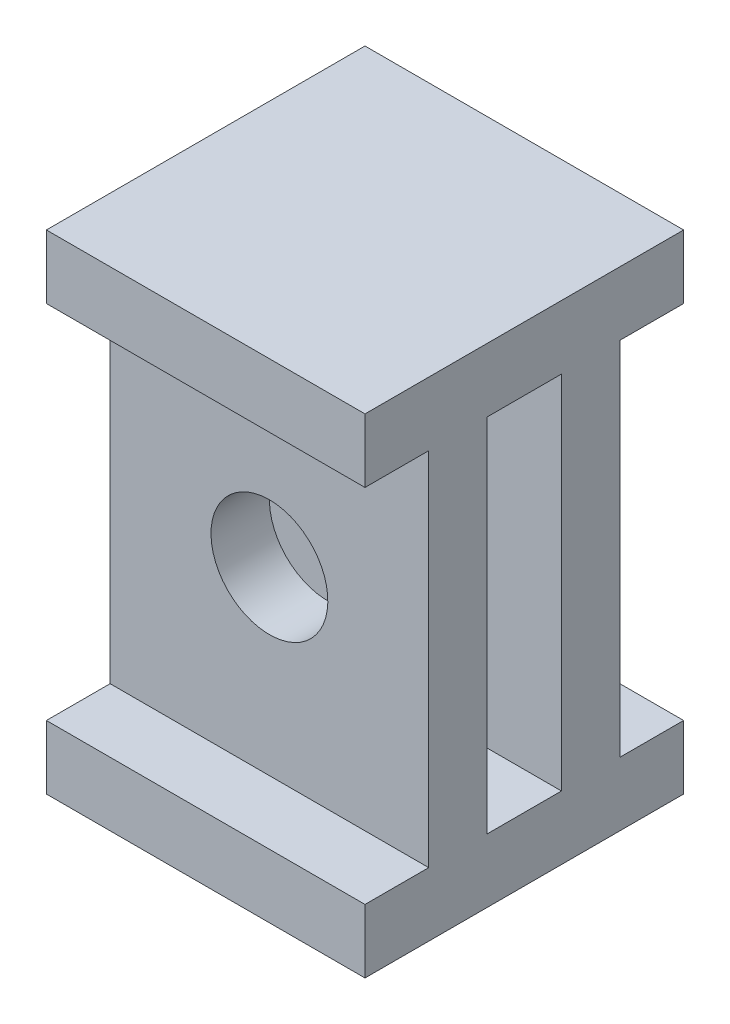
ISO-10303-21;
HEADER;
FILE_DESCRIPTION(('STEP AP214'),'2;1');
FILE_NAME('part.step','',(''),(''),'','','');
FILE_SCHEMA(('AUTOMOTIVE_DESIGN { 1 0 10303 214 1 1 1 1 }'));
ENDSEC;
DATA;
#1=APPLICATION_CONTEXT('core data for automotive mechanical design processes');
#2=APPLICATION_PROTOCOL_DEFINITION('international standard','automotive_design',2000,#1);
#3=PRODUCT_CONTEXT('',#1,'mechanical');
#4=PRODUCT('Part','Part','',(#3));
#5=PRODUCT_RELATED_PRODUCT_CATEGORY('part','',(#4));
#6=PRODUCT_DEFINITION_FORMATION('','',#4);
#7=PRODUCT_DEFINITION_CONTEXT('part definition',#1,'design');
#8=PRODUCT_DEFINITION('design','',#6,#7);
#9=PRODUCT_DEFINITION_SHAPE('','',#8);
#10=(LENGTH_UNIT() NAMED_UNIT(*) SI_UNIT(.MILLI.,.METRE.));
#11=(NAMED_UNIT(*) PLANE_ANGLE_UNIT() SI_UNIT($,.RADIAN.));
#12=(NAMED_UNIT(*) SI_UNIT($,.STERADIAN.) SOLID_ANGLE_UNIT());
#13=UNCERTAINTY_MEASURE_WITH_UNIT(LENGTH_MEASURE(1.E-05),#10,'distance_accuracy_value','');
#14=(GEOMETRIC_REPRESENTATION_CONTEXT(3) GLOBAL_UNCERTAINTY_ASSIGNED_CONTEXT((#13)) GLOBAL_UNIT_ASSIGNED_CONTEXT((#10,
#11,#12)) REPRESENTATION_CONTEXT('',''));
#15=CARTESIAN_POINT('',(0.,0.,0.));
#16=DIRECTION('',(0.,0.,1.));
#17=DIRECTION('',(1.,0.,0.));
#18=AXIS2_PLACEMENT_3D('',#15,#16,#17);
#19=CARTESIAN_POINT('',(0.,23.,-7.5));
#20=DIRECTION('',(0.,0.,1.));
#21=DIRECTION('',(1.,0.,0.));
#22=AXIS2_PLACEMENT_3D('',#19,#20,#21);
#23=PLANE('',#22);
#24=DIRECTION('',(0.,-1.,0.));
#25=VECTOR('',#24,1.);
#26=CARTESIAN_POINT('',(0.,23.,-7.5));
#27=LINE('',#26,#25);
#28=CARTESIAN_POINT('',(0.,3.,-7.5));
#29=VERTEX_POINT('',#28);
#30=CARTESIAN_POINT('',(0.,0.,-7.5));
#31=VERTEX_POINT('',#30);
#32=EDGE_CURVE('E262',#29,#31,#27,.T.);
#33=ORIENTED_EDGE('',*,*,#32,.F.);
#34=DIRECTION('',(1.,0.,0.));
#35=VECTOR('',#34,1.);
#36=CARTESIAN_POINT('',(0.,3.,-7.5));
#37=LINE('',#36,#35);
#38=CARTESIAN_POINT('',(15.,3.,-7.5));
#39=VERTEX_POINT('',#38);
#40=EDGE_CURVE('E181',#29,#39,#37,.T.);
#41=ORIENTED_EDGE('',*,*,#40,.T.);
#42=DIRECTION('',(0.,-1.,0.));
#43=VECTOR('',#42,1.);
#44=CARTESIAN_POINT('',(15.,23.,-7.5));
#45=LINE('',#44,#43);
#46=CARTESIAN_POINT('',(15.,0.,-7.5));
#47=VERTEX_POINT('',#46);
#48=EDGE_CURVE('E42',#39,#47,#45,.T.);
#49=ORIENTED_EDGE('',*,*,#48,.T.);
#50=DIRECTION('',(-1.,0.,0.));
#51=VECTOR('',#50,1.);
#52=CARTESIAN_POINT('',(0.,0.,-7.5));
#53=LINE('',#52,#51);
#54=EDGE_CURVE('E258',#47,#31,#53,.T.);
#55=ORIENTED_EDGE('',*,*,#54,.T.);
#56=EDGE_LOOP('',(#33,#41,#49,#55));
#57=FACE_BOUND('',#56,.T.);
#58=ADVANCED_FACE('F33',(#57),#23,.F.);
#59=CARTESIAN_POINT('',(0.,23.,7.5));
#60=DIRECTION('',(0.,0.,-1.));
#61=DIRECTION('',(1.,0.,0.));
#62=AXIS2_PLACEMENT_3D('',#59,#60,#61);
#63=PLANE('',#62);
#64=DIRECTION('',(0.,-1.,0.));
#65=VECTOR('',#64,1.);
#66=CARTESIAN_POINT('',(0.,23.,7.5));
#67=LINE('',#66,#65);
#68=CARTESIAN_POINT('',(0.,23.,7.5));
#69=VERTEX_POINT('',#68);
#70=CARTESIAN_POINT('',(0.,20.,7.5));
#71=VERTEX_POINT('',#70);
#72=EDGE_CURVE('E247',#69,#71,#67,.T.);
#73=ORIENTED_EDGE('',*,*,#72,.T.);
#74=DIRECTION('',(1.,0.,0.));
#75=VECTOR('',#74,1.);
#76=CARTESIAN_POINT('',(0.,20.,7.5));
#77=LINE('',#76,#75);
#78=CARTESIAN_POINT('',(15.,20.,7.5));
#79=VERTEX_POINT('',#78);
#80=EDGE_CURVE('E183',#71,#79,#77,.T.);
#81=ORIENTED_EDGE('',*,*,#80,.T.);
#82=DIRECTION('',(0.,-1.,0.));
#83=VECTOR('',#82,1.);
#84=CARTESIAN_POINT('',(15.,23.,7.5));
#85=LINE('',#84,#83);
#86=CARTESIAN_POINT('',(15.,23.,7.5));
#87=VERTEX_POINT('',#86);
#88=EDGE_CURVE('E251',#87,#79,#85,.T.);
#89=ORIENTED_EDGE('',*,*,#88,.F.);
#90=DIRECTION('',(-1.,0.,0.));
#91=VECTOR('',#90,1.);
#92=CARTESIAN_POINT('',(0.,23.,7.5));
#93=LINE('',#92,#91);
#94=EDGE_CURVE('E242',#87,#69,#93,.T.);
#95=ORIENTED_EDGE('',*,*,#94,.T.);
#96=EDGE_LOOP('',(#73,#81,#89,#95));
#97=FACE_BOUND('',#96,.T.);
#98=ADVANCED_FACE('F293',(#97),#63,.F.);
#99=CARTESIAN_POINT('',(0.,23.,0.));
#100=DIRECTION('',(1.,0.,0.));
#101=DIRECTION('',(0.,0.,-1.));
#102=AXIS2_PLACEMENT_3D('',#99,#100,#101);
#103=PLANE('',#102);
#104=DIRECTION('',(0.,0.,1.));
#105=VECTOR('',#104,1.);
#106=CARTESIAN_POINT('',(0.,20.,1.75));
#107=LINE('',#106,#105);
#108=CARTESIAN_POINT('',(0.,20.,-1.75));
#109=VERTEX_POINT('',#108);
#110=CARTESIAN_POINT('',(0.,20.,1.75));
#111=VERTEX_POINT('',#110);
#112=EDGE_CURVE('E223',#109,#111,#107,.T.);
#113=ORIENTED_EDGE('',*,*,#112,.T.);
#114=DIRECTION('',(0.,-1.,0.));
#115=VECTOR('',#114,1.);
#116=CARTESIAN_POINT('',(0.,20.,1.75));
#117=LINE('',#116,#115);
#118=CARTESIAN_POINT('',(0.,3.,1.75));
#119=VERTEX_POINT('',#118);
#120=EDGE_CURVE('E215',#111,#119,#117,.T.);
#121=ORIENTED_EDGE('',*,*,#120,.T.);
#122=DIRECTION('',(0.,0.,-1.));
#123=VECTOR('',#122,1.);
#124=CARTESIAN_POINT('',(0.,3.,1.75));
#125=LINE('',#124,#123);
#126=CARTESIAN_POINT('',(0.,3.,-1.75));
#127=VERTEX_POINT('',#126);
#128=EDGE_CURVE('E218',#119,#127,#125,.T.);
#129=ORIENTED_EDGE('',*,*,#128,.T.);
#130=DIRECTION('',(0.,1.,0.));
#131=VECTOR('',#130,1.);
#132=CARTESIAN_POINT('',(0.,20.,-1.75));
#133=LINE('',#132,#131);
#134=EDGE_CURVE('E49',#127,#109,#133,.T.);
#135=ORIENTED_EDGE('',*,*,#134,.T.);
#136=EDGE_LOOP('',(#113,#121,#129,#135));
#137=FACE_BOUND('',#136,.T.);
#138=DIRECTION('',(0.,1.,0.));
#139=VECTOR('',#138,1.);
#140=CARTESIAN_POINT('',(0.,20.,4.5));
#141=LINE('',#140,#139);
#142=CARTESIAN_POINT('',(0.,3.,4.5));
#143=VERTEX_POINT('',#142);
#144=CARTESIAN_POINT('',(0.,20.,4.5));
#145=VERTEX_POINT('',#144);
#146=EDGE_CURVE('E161',#143,#145,#141,.T.);
#147=ORIENTED_EDGE('',*,*,#146,.T.);
#148=DIRECTION('',(0.,0.,1.));
#149=VECTOR('',#148,1.);
#150=CARTESIAN_POINT('',(0.,20.,7.5));
#151=LINE('',#150,#149);
#152=EDGE_CURVE('E166',#145,#71,#151,.T.);
#153=ORIENTED_EDGE('',*,*,#152,.T.);
#154=ORIENTED_EDGE('',*,*,#72,.F.);
#155=DIRECTION('',(0.,0.,1.));
#156=VECTOR('',#155,1.);
#157=CARTESIAN_POINT('',(0.,23.,0.));
#158=LINE('',#157,#156);
#159=CARTESIAN_POINT('',(0.,23.,-7.5));
#160=VERTEX_POINT('',#159);
#161=EDGE_CURVE('E255',#160,#69,#158,.T.);
#162=ORIENTED_EDGE('',*,*,#161,.F.);
#163=CARTESIAN_POINT('',(0.,20.,-7.5));
#164=VERTEX_POINT('',#163);
#165=EDGE_CURVE('E269',#160,#164,#27,.T.);
#166=ORIENTED_EDGE('',*,*,#165,.T.);
#167=DIRECTION('',(0.,0.,1.));
#168=VECTOR('',#167,1.);
#169=CARTESIAN_POINT('',(0.,20.,-7.5));
#170=LINE('',#169,#168);
#171=CARTESIAN_POINT('',(0.,20.,-4.5));
#172=VERTEX_POINT('',#171);
#173=EDGE_CURVE('E189',#164,#172,#170,.T.);
#174=ORIENTED_EDGE('',*,*,#173,.T.);
#175=DIRECTION('',(0.,-1.,0.));
#176=VECTOR('',#175,1.);
#177=CARTESIAN_POINT('',(0.,20.,-4.5));
#178=LINE('',#177,#176);
#179=CARTESIAN_POINT('',(0.,3.,-4.5));
#180=VERTEX_POINT('',#179);
#181=EDGE_CURVE('E192',#172,#180,#178,.T.);
#182=ORIENTED_EDGE('',*,*,#181,.T.);
#183=DIRECTION('',(0.,0.,-1.));
#184=VECTOR('',#183,1.);
#185=CARTESIAN_POINT('',(0.,3.,-7.5));
#186=LINE('',#185,#184);
#187=EDGE_CURVE('E196',#180,#29,#186,.T.);
#188=ORIENTED_EDGE('',*,*,#187,.T.);
#189=ORIENTED_EDGE('',*,*,#32,.T.);
#190=DIRECTION('',(0.,0.,1.));
#191=VECTOR('',#190,1.);
#192=CARTESIAN_POINT('',(0.,0.,0.));
#193=LINE('',#192,#191);
#194=CARTESIAN_POINT('',(0.,0.,7.5));
#195=VERTEX_POINT('',#194);
#196=EDGE_CURVE('E254',#31,#195,#193,.T.);
#197=ORIENTED_EDGE('',*,*,#196,.T.);
#198=CARTESIAN_POINT('',(0.,3.,7.5));
#199=VERTEX_POINT('',#198);
#200=EDGE_CURVE('E170',#199,#195,#67,.T.);
#201=ORIENTED_EDGE('',*,*,#200,.F.);
#202=DIRECTION('',(0.,0.,-1.));
#203=VECTOR('',#202,1.);
#204=CARTESIAN_POINT('',(0.,3.,7.5));
#205=LINE('',#204,#203);
#206=EDGE_CURVE('E150',#199,#143,#205,.T.);
#207=ORIENTED_EDGE('',*,*,#206,.T.);
#208=EDGE_LOOP('',(#147,#153,#154,#162,#166,#174,#182,#188,#189,#197,#201,#207));
#209=FACE_BOUND('',#208,.T.);
#210=ADVANCED_FACE('F35',(#137,#209),#103,.F.);
#211=CARTESIAN_POINT('',(15.,23.,0.));
#212=DIRECTION('',(-1.,0.,0.));
#213=DIRECTION('',(0.,0.,1.));
#214=AXIS2_PLACEMENT_3D('',#211,#212,#213);
#215=PLANE('',#214);
#216=DIRECTION('',(0.,0.,-1.));
#217=VECTOR('',#216,1.);
#218=CARTESIAN_POINT('',(15.,3.,1.75));
#219=LINE('',#218,#217);
#220=CARTESIAN_POINT('',(15.,3.,1.75));
#221=VERTEX_POINT('',#220);
#222=CARTESIAN_POINT('',(15.,3.,-1.75));
#223=VERTEX_POINT('',#222);
#224=EDGE_CURVE('E228',#221,#223,#219,.T.);
#225=ORIENTED_EDGE('',*,*,#224,.F.);
#226=DIRECTION('',(0.,-1.,0.));
#227=VECTOR('',#226,1.);
#228=CARTESIAN_POINT('',(15.,20.,1.75));
#229=LINE('',#228,#227);
#230=CARTESIAN_POINT('',(15.,20.,1.75));
#231=VERTEX_POINT('',#230);
#232=EDGE_CURVE('E57',#231,#221,#229,.T.);
#233=ORIENTED_EDGE('',*,*,#232,.F.);
#234=DIRECTION('',(0.,0.,1.));
#235=VECTOR('',#234,1.);
#236=CARTESIAN_POINT('',(15.,20.,1.75));
#237=LINE('',#236,#235);
#238=CARTESIAN_POINT('',(15.,20.,-1.75));
#239=VERTEX_POINT('',#238);
#240=EDGE_CURVE('E219',#239,#231,#237,.T.);
#241=ORIENTED_EDGE('',*,*,#240,.F.);
#242=DIRECTION('',(0.,1.,0.));
#243=VECTOR('',#242,1.);
#244=CARTESIAN_POINT('',(15.,20.,-1.75));
#245=LINE('',#244,#243);
#246=EDGE_CURVE('E231',#223,#239,#245,.T.);
#247=ORIENTED_EDGE('',*,*,#246,.F.);
#248=EDGE_LOOP('',(#225,#233,#241,#247));
#249=FACE_BOUND('',#248,.T.);
#250=ORIENTED_EDGE('',*,*,#88,.T.);
#251=DIRECTION('',(0.,0.,1.));
#252=VECTOR('',#251,1.);
#253=CARTESIAN_POINT('',(15.,20.,7.5));
#254=LINE('',#253,#252);
#255=CARTESIAN_POINT('',(15.,20.,4.5));
#256=VERTEX_POINT('',#255);
#257=EDGE_CURVE('E171',#256,#79,#254,.T.);
#258=ORIENTED_EDGE('',*,*,#257,.F.);
#259=DIRECTION('',(0.,1.,0.));
#260=VECTOR('',#259,1.);
#261=CARTESIAN_POINT('',(15.,20.,4.5));
#262=LINE('',#261,#260);
#263=CARTESIAN_POINT('',(15.,3.,4.5));
#264=VERTEX_POINT('',#263);
#265=EDGE_CURVE('E173',#264,#256,#262,.T.);
#266=ORIENTED_EDGE('',*,*,#265,.F.);
#267=DIRECTION('',(0.,0.,-1.));
#268=VECTOR('',#267,1.);
#269=CARTESIAN_POINT('',(15.,3.,7.5));
#270=LINE('',#269,#268);
#271=CARTESIAN_POINT('',(15.,3.,7.5));
#272=VERTEX_POINT('',#271);
#273=EDGE_CURVE('E153',#272,#264,#270,.T.);
#274=ORIENTED_EDGE('',*,*,#273,.F.);
#275=CARTESIAN_POINT('',(15.,0.,7.5));
#276=VERTEX_POINT('',#275);
#277=EDGE_CURVE('E250',#272,#276,#85,.T.);
#278=ORIENTED_EDGE('',*,*,#277,.T.);
#279=DIRECTION('',(0.,0.,-1.));
#280=VECTOR('',#279,1.);
#281=CARTESIAN_POINT('',(15.,0.,0.));
#282=LINE('',#281,#280);
#283=EDGE_CURVE('E264',#276,#47,#282,.T.);
#284=ORIENTED_EDGE('',*,*,#283,.T.);
#285=ORIENTED_EDGE('',*,*,#48,.F.);
#286=DIRECTION('',(0.,0.,-1.));
#287=VECTOR('',#286,1.);
#288=CARTESIAN_POINT('',(15.,3.,-7.5));
#289=LINE('',#288,#287);
#290=CARTESIAN_POINT('',(15.,3.,-4.5));
#291=VERTEX_POINT('',#290);
#292=EDGE_CURVE('E193',#291,#39,#289,.T.);
#293=ORIENTED_EDGE('',*,*,#292,.F.);
#294=DIRECTION('',(0.,-1.,0.));
#295=VECTOR('',#294,1.);
#296=CARTESIAN_POINT('',(15.,20.,-4.5));
#297=LINE('',#296,#295);
#298=CARTESIAN_POINT('',(15.,20.,-4.5));
#299=VERTEX_POINT('',#298);
#300=EDGE_CURVE('E203',#299,#291,#297,.T.);
#301=ORIENTED_EDGE('',*,*,#300,.F.);
#302=DIRECTION('',(0.,0.,1.));
#303=VECTOR('',#302,1.);
#304=CARTESIAN_POINT('',(15.,20.,-7.5));
#305=LINE('',#304,#303);
#306=CARTESIAN_POINT('',(15.,20.,-7.5));
#307=VERTEX_POINT('',#306);
#308=EDGE_CURVE('E200',#307,#299,#305,.T.);
#309=ORIENTED_EDGE('',*,*,#308,.F.);
#310=CARTESIAN_POINT('',(15.,23.,-7.5));
#311=VERTEX_POINT('',#310);
#312=EDGE_CURVE('E11',#311,#307,#45,.T.);
#313=ORIENTED_EDGE('',*,*,#312,.F.);
#314=DIRECTION('',(0.,0.,-1.));
#315=VECTOR('',#314,1.);
#316=CARTESIAN_POINT('',(15.,23.,0.));
#317=LINE('',#316,#315);
#318=EDGE_CURVE('E257',#87,#311,#317,.T.);
#319=ORIENTED_EDGE('',*,*,#318,.F.);
#320=EDGE_LOOP('',(#250,#258,#266,#274,#278,#284,#285,#293,#301,#309,#313,#319));
#321=FACE_BOUND('',#320,.T.);
#322=ADVANCED_FACE('F287',(#249,#321),#215,.F.);
#323=ORIENTED_EDGE('',*,*,#312,.T.);
#324=DIRECTION('',(1.,0.,0.));
#325=VECTOR('',#324,1.);
#326=CARTESIAN_POINT('',(0.,20.,-7.5));
#327=LINE('',#326,#325);
#328=EDGE_CURVE('E199',#164,#307,#327,.T.);
#329=ORIENTED_EDGE('',*,*,#328,.F.);
#330=ORIENTED_EDGE('',*,*,#165,.F.);
#331=DIRECTION('',(-1.,0.,0.));
#332=VECTOR('',#331,1.);
#333=CARTESIAN_POINT('',(0.,23.,-7.5));
#334=LINE('',#333,#332);
#335=EDGE_CURVE('E260',#311,#160,#334,.T.);
#336=ORIENTED_EDGE('',*,*,#335,.F.);
#337=EDGE_LOOP('',(#323,#329,#330,#336));
#338=FACE_BOUND('',#337,.T.);
#339=ADVANCED_FACE('F302',(#338),#23,.F.);
#340=CARTESIAN_POINT('',(0.,23.,0.));
#341=DIRECTION('',(0.,-1.,0.));
#342=DIRECTION('',(0.,0.,-1.));
#343=AXIS2_PLACEMENT_3D('',#340,#341,#342);
#344=PLANE('',#343);
#345=ORIENTED_EDGE('',*,*,#161,.T.);
#346=ORIENTED_EDGE('',*,*,#94,.F.);
#347=ORIENTED_EDGE('',*,*,#318,.T.);
#348=ORIENTED_EDGE('',*,*,#335,.T.);
#349=EDGE_LOOP('',(#345,#346,#347,#348));
#350=FACE_BOUND('',#349,.T.);
#351=ADVANCED_FACE('F297',(#350),#344,.F.);
#352=CARTESIAN_POINT('',(0.,0.,0.));
#353=DIRECTION('',(0.,-1.,0.));
#354=DIRECTION('',(0.,0.,-1.));
#355=AXIS2_PLACEMENT_3D('',#352,#353,#354);
#356=PLANE('',#355);
#357=ORIENTED_EDGE('',*,*,#196,.F.);
#358=ORIENTED_EDGE('',*,*,#54,.F.);
#359=ORIENTED_EDGE('',*,*,#283,.F.);
#360=DIRECTION('',(-1.,0.,0.));
#361=VECTOR('',#360,1.);
#362=CARTESIAN_POINT('',(0.,0.,7.5));
#363=LINE('',#362,#361);
#364=EDGE_CURVE('E186',#276,#195,#363,.T.);
#365=ORIENTED_EDGE('',*,*,#364,.T.);
#366=EDGE_LOOP('',(#357,#358,#359,#365));
#367=FACE_BOUND('',#366,.T.);
#368=ADVANCED_FACE('F281',(#367),#356,.T.);
#369=ORIENTED_EDGE('',*,*,#277,.F.);
#370=DIRECTION('',(1.,0.,0.));
#371=VECTOR('',#370,1.);
#372=CARTESIAN_POINT('',(0.,3.,7.5));
#373=LINE('',#372,#371);
#374=EDGE_CURVE('E158',#199,#272,#373,.T.);
#375=ORIENTED_EDGE('',*,*,#374,.F.);
#376=ORIENTED_EDGE('',*,*,#200,.T.);
#377=ORIENTED_EDGE('',*,*,#364,.F.);
#378=EDGE_LOOP('',(#369,#375,#376,#377));
#379=FACE_BOUND('',#378,.T.);
#380=ADVANCED_FACE('F285',(#379),#63,.F.);
#381=CARTESIAN_POINT('',(0.,20.,7.5));
#382=DIRECTION('',(0.,1.,0.));
#383=DIRECTION('',(0.,0.,1.));
#384=AXIS2_PLACEMENT_3D('',#381,#382,#383);
#385=PLANE('',#384);
#386=ORIENTED_EDGE('',*,*,#257,.T.);
#387=ORIENTED_EDGE('',*,*,#80,.F.);
#388=ORIENTED_EDGE('',*,*,#152,.F.);
#389=DIRECTION('',(1.,0.,0.));
#390=VECTOR('',#389,1.);
#391=CARTESIAN_POINT('',(0.,20.,4.5));
#392=LINE('',#391,#390);
#393=EDGE_CURVE('E157',#145,#256,#392,.T.);
#394=ORIENTED_EDGE('',*,*,#393,.T.);
#395=EDGE_LOOP('',(#386,#387,#388,#394));
#396=FACE_BOUND('',#395,.T.);
#397=ADVANCED_FACE('F291',(#396),#385,.F.);
#398=CARTESIAN_POINT('',(0.,20.,4.5));
#399=DIRECTION('',(0.,0.,-1.));
#400=DIRECTION('',(0.,1.,0.));
#401=AXIS2_PLACEMENT_3D('',#398,#399,#400);
#402=PLANE('',#401);
#403=CARTESIAN_POINT('',(7.5,11.5,4.5));
#404=DIRECTION('',(0.,0.,-1.));
#405=DIRECTION('',(0.,1.,0.));
#406=AXIS2_PLACEMENT_3D('',#403,#404,#405);
#407=CIRCLE('',#406,2.75);
#408=CARTESIAN_POINT('',(7.5,14.25,4.5));
#409=VERTEX_POINT('',#408);
#410=EDGE_CURVE('E176',#409,#409,#407,.T.);
#411=ORIENTED_EDGE('',*,*,#410,.T.);
#412=EDGE_LOOP('',(#411));
#413=FACE_BOUND('',#412,.T.);
#414=ORIENTED_EDGE('',*,*,#265,.T.);
#415=ORIENTED_EDGE('',*,*,#393,.F.);
#416=ORIENTED_EDGE('',*,*,#146,.F.);
#417=DIRECTION('',(1.,0.,0.));
#418=VECTOR('',#417,1.);
#419=CARTESIAN_POINT('',(0.,3.,4.5));
#420=LINE('',#419,#418);
#421=EDGE_CURVE('E146',#143,#264,#420,.T.);
#422=ORIENTED_EDGE('',*,*,#421,.T.);
#423=EDGE_LOOP('',(#414,#415,#416,#422));
#424=FACE_BOUND('',#423,.T.);
#425=ADVANCED_FACE('F162',(#413,#424),#402,.F.);
#426=CARTESIAN_POINT('',(0.,3.,7.5));
#427=DIRECTION('',(0.,-1.,0.));
#428=DIRECTION('',(0.,0.,-1.));
#429=AXIS2_PLACEMENT_3D('',#426,#427,#428);
#430=PLANE('',#429);
#431=ORIENTED_EDGE('',*,*,#273,.T.);
#432=ORIENTED_EDGE('',*,*,#421,.F.);
#433=ORIENTED_EDGE('',*,*,#206,.F.);
#434=ORIENTED_EDGE('',*,*,#374,.T.);
#435=EDGE_LOOP('',(#431,#432,#433,#434));
#436=FACE_BOUND('',#435,.T.);
#437=ADVANCED_FACE('F148',(#436),#430,.F.);
#438=CARTESIAN_POINT('',(0.,3.,-7.5));
#439=DIRECTION('',(0.,-1.,0.));
#440=DIRECTION('',(0.,0.,-1.));
#441=AXIS2_PLACEMENT_3D('',#438,#439,#440);
#442=PLANE('',#441);
#443=ORIENTED_EDGE('',*,*,#292,.T.);
#444=ORIENTED_EDGE('',*,*,#40,.F.);
#445=ORIENTED_EDGE('',*,*,#187,.F.);
#446=DIRECTION('',(1.,0.,0.));
#447=VECTOR('',#446,1.);
#448=CARTESIAN_POINT('',(0.,3.,-4.5));
#449=LINE('',#448,#447);
#450=EDGE_CURVE('E210',#180,#291,#449,.T.);
#451=ORIENTED_EDGE('',*,*,#450,.T.);
#452=EDGE_LOOP('',(#443,#444,#445,#451));
#453=FACE_BOUND('',#452,.T.);
#454=ADVANCED_FACE('F312',(#453),#442,.F.);
#455=CARTESIAN_POINT('',(0.,20.,-4.5));
#456=DIRECTION('',(0.,0.,1.));
#457=DIRECTION('',(0.,-1.,0.));
#458=AXIS2_PLACEMENT_3D('',#455,#456,#457);
#459=PLANE('',#458);
#460=CARTESIAN_POINT('',(7.5,11.5,-4.5));
#461=DIRECTION('',(0.,0.,-1.));
#462=DIRECTION('',(0.,1.,0.));
#463=AXIS2_PLACEMENT_3D('',#460,#461,#462);
#464=CIRCLE('',#463,2.75);
#465=CARTESIAN_POINT('',(7.5,14.25,-4.5));
#466=VERTEX_POINT('',#465);
#467=EDGE_CURVE('E449',#466,#466,#464,.T.);
#468=ORIENTED_EDGE('',*,*,#467,.F.);
#469=EDGE_LOOP('',(#468));
#470=FACE_BOUND('',#469,.T.);
#471=ORIENTED_EDGE('',*,*,#300,.T.);
#472=ORIENTED_EDGE('',*,*,#450,.F.);
#473=ORIENTED_EDGE('',*,*,#181,.F.);
#474=DIRECTION('',(1.,0.,0.));
#475=VECTOR('',#474,1.);
#476=CARTESIAN_POINT('',(0.,20.,-4.5));
#477=LINE('',#476,#475);
#478=EDGE_CURVE('E212',#172,#299,#477,.T.);
#479=ORIENTED_EDGE('',*,*,#478,.T.);
#480=EDGE_LOOP('',(#471,#472,#473,#479));
#481=FACE_BOUND('',#480,.T.);
#482=ADVANCED_FACE('F309',(#470,#481),#459,.F.);
#483=CARTESIAN_POINT('',(0.,20.,-7.5));
#484=DIRECTION('',(0.,1.,0.));
#485=DIRECTION('',(0.,0.,1.));
#486=AXIS2_PLACEMENT_3D('',#483,#484,#485);
#487=PLANE('',#486);
#488=ORIENTED_EDGE('',*,*,#308,.T.);
#489=ORIENTED_EDGE('',*,*,#478,.F.);
#490=ORIENTED_EDGE('',*,*,#173,.F.);
#491=ORIENTED_EDGE('',*,*,#328,.T.);
#492=EDGE_LOOP('',(#488,#489,#490,#491));
#493=FACE_BOUND('',#492,.T.);
#494=ADVANCED_FACE('F305',(#493),#487,.F.);
#495=CARTESIAN_POINT('',(0.,20.,1.75));
#496=DIRECTION('',(0.,0.,1.));
#497=DIRECTION('',(0.,-1.,0.));
#498=AXIS2_PLACEMENT_3D('',#495,#496,#497);
#499=PLANE('',#498);
#500=CARTESIAN_POINT('',(7.5,11.5,1.75));
#501=DIRECTION('',(0.,0.,1.));
#502=DIRECTION('',(0.,-1.,0.));
#503=AXIS2_PLACEMENT_3D('',#500,#501,#502);
#504=CIRCLE('',#503,2.75);
#505=CARTESIAN_POINT('',(7.5,14.25,1.75));
#506=VERTEX_POINT('',#505);
#507=EDGE_CURVE('E446',#506,#506,#504,.T.);
#508=ORIENTED_EDGE('',*,*,#507,.T.);
#509=EDGE_LOOP('',(#508));
#510=FACE_BOUND('',#509,.T.);
#511=ORIENTED_EDGE('',*,*,#232,.T.);
#512=DIRECTION('',(1.,0.,0.));
#513=VECTOR('',#512,1.);
#514=CARTESIAN_POINT('',(0.,3.,1.75));
#515=LINE('',#514,#513);
#516=EDGE_CURVE('E226',#119,#221,#515,.T.);
#517=ORIENTED_EDGE('',*,*,#516,.F.);
#518=ORIENTED_EDGE('',*,*,#120,.F.);
#519=DIRECTION('',(1.,0.,0.));
#520=VECTOR('',#519,1.);
#521=CARTESIAN_POINT('',(0.,20.,1.75));
#522=LINE('',#521,#520);
#523=EDGE_CURVE('E204',#111,#231,#522,.T.);
#524=ORIENTED_EDGE('',*,*,#523,.T.);
#525=EDGE_LOOP('',(#511,#517,#518,#524));
#526=FACE_BOUND('',#525,.T.);
#527=ADVANCED_FACE('F347',(#510,#526),#499,.F.);
#528=CARTESIAN_POINT('',(0.,20.,1.75));
#529=DIRECTION('',(0.,1.,0.));
#530=DIRECTION('',(0.,0.,1.));
#531=AXIS2_PLACEMENT_3D('',#528,#529,#530);
#532=PLANE('',#531);
#533=ORIENTED_EDGE('',*,*,#240,.T.);
#534=ORIENTED_EDGE('',*,*,#523,.F.);
#535=ORIENTED_EDGE('',*,*,#112,.F.);
#536=DIRECTION('',(1.,0.,0.));
#537=VECTOR('',#536,1.);
#538=CARTESIAN_POINT('',(0.,20.,-1.75));
#539=LINE('',#538,#537);
#540=EDGE_CURVE('E237',#109,#239,#539,.T.);
#541=ORIENTED_EDGE('',*,*,#540,.T.);
#542=EDGE_LOOP('',(#533,#534,#535,#541));
#543=FACE_BOUND('',#542,.T.);
#544=ADVANCED_FACE('F350',(#543),#532,.F.);
#545=CARTESIAN_POINT('',(0.,20.,-1.75));
#546=DIRECTION('',(0.,0.,-1.));
#547=DIRECTION('',(0.,1.,0.));
#548=AXIS2_PLACEMENT_3D('',#545,#546,#547);
#549=PLANE('',#548);
#550=CARTESIAN_POINT('',(7.5,11.5,-1.75));
#551=DIRECTION('',(0.,0.,-1.));
#552=DIRECTION('',(0.,1.,0.));
#553=AXIS2_PLACEMENT_3D('',#550,#551,#552);
#554=CIRCLE('',#553,2.75);
#555=CARTESIAN_POINT('',(7.5,14.25,-1.75));
#556=VERTEX_POINT('',#555);
#557=EDGE_CURVE('E37',#556,#556,#554,.T.);
#558=ORIENTED_EDGE('',*,*,#557,.T.);
#559=EDGE_LOOP('',(#558));
#560=FACE_BOUND('',#559,.T.);
#561=ORIENTED_EDGE('',*,*,#246,.T.);
#562=ORIENTED_EDGE('',*,*,#540,.F.);
#563=ORIENTED_EDGE('',*,*,#134,.F.);
#564=DIRECTION('',(1.,0.,0.));
#565=VECTOR('',#564,1.);
#566=CARTESIAN_POINT('',(0.,3.,-1.75));
#567=LINE('',#566,#565);
#568=EDGE_CURVE('E239',#127,#223,#567,.T.);
#569=ORIENTED_EDGE('',*,*,#568,.T.);
#570=EDGE_LOOP('',(#561,#562,#563,#569));
#571=FACE_BOUND('',#570,.T.);
#572=ADVANCED_FACE('F351',(#560,#571),#549,.F.);
#573=CARTESIAN_POINT('',(0.,3.,1.75));
#574=DIRECTION('',(0.,-1.,0.));
#575=DIRECTION('',(0.,0.,-1.));
#576=AXIS2_PLACEMENT_3D('',#573,#574,#575);
#577=PLANE('',#576);
#578=ORIENTED_EDGE('',*,*,#224,.T.);
#579=ORIENTED_EDGE('',*,*,#568,.F.);
#580=ORIENTED_EDGE('',*,*,#128,.F.);
#581=ORIENTED_EDGE('',*,*,#516,.T.);
#582=EDGE_LOOP('',(#578,#579,#580,#581));
#583=FACE_BOUND('',#582,.T.);
#584=ADVANCED_FACE('F344',(#583),#577,.F.);
#585=CARTESIAN_POINT('',(7.5,11.5,7.5));
#586=DIRECTION('',(0.,0.,-1.));
#587=DIRECTION('',(0.,1.,0.));
#588=AXIS2_PLACEMENT_3D('',#585,#586,#587);
#589=CYLINDRICAL_SURFACE('',#588,2.75);
#590=CARTESIAN_POINT('',(7.5,14.25,-4.5));
#591=CARTESIAN_POINT('',(7.5,14.25,-4.47135416666667));
#592=CARTESIAN_POINT('',(7.5,14.25,-4.44270833333333));
#593=CARTESIAN_POINT('',(7.5,14.25,-4.38541666666667));
#594=CARTESIAN_POINT('',(7.5,14.25,-4.35677083333333));
#595=CARTESIAN_POINT('',(7.5,14.25,-4.29947916666667));
#596=CARTESIAN_POINT('',(7.5,14.25,-4.27083333333333));
#597=CARTESIAN_POINT('',(7.5,14.25,-4.21354166666667));
#598=CARTESIAN_POINT('',(7.5,14.25,-4.18489583333333));
#599=CARTESIAN_POINT('',(7.5,14.25,-4.12760416666667));
#600=CARTESIAN_POINT('',(7.5,14.25,-4.09895833333333));
#601=CARTESIAN_POINT('',(7.5,14.25,-4.04166666666667));
#602=CARTESIAN_POINT('',(7.5,14.25,-4.01302083333333));
#603=CARTESIAN_POINT('',(7.5,14.25,-3.95572916666667));
#604=CARTESIAN_POINT('',(7.5,14.25,-3.92708333333333));
#605=CARTESIAN_POINT('',(7.5,14.25,-3.86979166666667));
#606=CARTESIAN_POINT('',(7.5,14.25,-3.84114583333333));
#607=CARTESIAN_POINT('',(7.5,14.25,-3.78385416666667));
#608=CARTESIAN_POINT('',(7.5,14.25,-3.75520833333333));
#609=CARTESIAN_POINT('',(7.5,14.25,-3.69791666666667));
#610=CARTESIAN_POINT('',(7.5,14.25,-3.66927083333334));
#611=CARTESIAN_POINT('',(7.5,14.25,-3.61197916666667));
#612=CARTESIAN_POINT('',(7.5,14.25,-3.58333333333334));
#613=CARTESIAN_POINT('',(7.5,14.25,-3.52604166666667));
#614=CARTESIAN_POINT('',(7.5,14.25,-3.49739583333334));
#615=CARTESIAN_POINT('',(7.5,14.25,-3.44010416666667));
#616=CARTESIAN_POINT('',(7.5,14.25,-3.41145833333333));
#617=CARTESIAN_POINT('',(7.5,14.25,-3.35416666666667));
#618=CARTESIAN_POINT('',(7.5,14.25,-3.32552083333334));
#619=CARTESIAN_POINT('',(7.5,14.25,-3.26822916666667));
#620=CARTESIAN_POINT('',(7.5,14.25,-3.23958333333333));
#621=CARTESIAN_POINT('',(7.5,14.25,-3.18229166666667));
#622=CARTESIAN_POINT('',(7.5,14.25,-3.15364583333334));
#623=CARTESIAN_POINT('',(7.5,14.25,-3.09635416666667));
#624=CARTESIAN_POINT('',(7.5,14.25,-3.06770833333334));
#625=CARTESIAN_POINT('',(7.5,14.25,-3.01041666666667));
#626=CARTESIAN_POINT('',(7.5,14.25,-2.98177083333334));
#627=CARTESIAN_POINT('',(7.5,14.25,-2.92447916666667));
#628=CARTESIAN_POINT('',(7.5,14.25,-2.89583333333334));
#629=CARTESIAN_POINT('',(7.5,14.25,-2.83854166666667));
#630=CARTESIAN_POINT('',(7.5,14.25,-2.80989583333334));
#631=CARTESIAN_POINT('',(7.5,14.25,-2.75260416666667));
#632=CARTESIAN_POINT('',(7.5,14.25,-2.72395833333334));
#633=CARTESIAN_POINT('',(7.5,14.25,-2.66666666666667));
#634=CARTESIAN_POINT('',(7.5,14.25,-2.63802083333334));
#635=CARTESIAN_POINT('',(7.5,14.25,-2.58072916666667));
#636=CARTESIAN_POINT('',(7.5,14.25,-2.55208333333334));
#637=CARTESIAN_POINT('',(7.5,14.25,-2.49479166666667));
#638=CARTESIAN_POINT('',(7.5,14.25,-2.46614583333334));
#639=CARTESIAN_POINT('',(7.5,14.25,-2.40885416666667));
#640=CARTESIAN_POINT('',(7.5,14.25,-2.38020833333334));
#641=CARTESIAN_POINT('',(7.5,14.25,-2.32291666666667));
#642=CARTESIAN_POINT('',(7.5,14.25,-2.29427083333333));
#643=CARTESIAN_POINT('',(7.5,14.25,-2.23697916666667));
#644=CARTESIAN_POINT('',(7.5,14.25,-2.20833333333334));
#645=CARTESIAN_POINT('',(7.5,14.25,-2.15104166666667));
#646=CARTESIAN_POINT('',(7.5,14.25,-2.12239583333334));
#647=CARTESIAN_POINT('',(7.5,14.25,-2.06510416666667));
#648=CARTESIAN_POINT('',(7.5,14.25,-2.03645833333334));
#649=CARTESIAN_POINT('',(7.5,14.25,-1.97916666666667));
#650=CARTESIAN_POINT('',(7.5,14.25,-1.95052083333334));
#651=CARTESIAN_POINT('',(7.5,14.25,-1.89322916666667));
#652=CARTESIAN_POINT('',(7.5,14.25,-1.86458333333334));
#653=CARTESIAN_POINT('',(7.5,14.25,-1.80729166666667));
#654=CARTESIAN_POINT('',(7.5,14.25,-1.77864583333334));
#655=CARTESIAN_POINT('',(7.5,14.25,-1.75));
#656=B_SPLINE_CURVE_WITH_KNOTS('',3,(#590,#591,#592,#593,#594,#595,#596,#597,#598,#599,#600,
#601,#602,#603,#604,#605,#606,#607,#608,#609,#610,#611,#612,#613,#614,#615,#616,#617,#618,#619,
#620,#621,#622,#623,#624,#625,#626,#627,#628,#629,#630,#631,#632,#633,#634,#635,#636,#637,#638,
#639,#640,#641,#642,#643,#644,#645,#646,#647,#648,#649,#650,#651,#652,#653,#654,#655),
.UNSPECIFIED.,.F.,.F.,(4,2,2,2,2,2,2,2,2,2,2,2,2,2,2,2,2,2,2,2,2,2,2,2,2,2,2,2,2,2,2,2,4),(0.,
0.0859374999999992,0.171875,0.257812499999999,0.34375,0.4296875,0.515625,0.6015625,
0.687500000000001,0.7734375,0.859374999999999,0.9453125,1.03125,1.1171875,1.203125,1.2890625,
1.375,1.4609375,1.546875,1.6328125,1.71875,1.8046875,1.890625,1.9765625,2.0625,2.1484375,
2.234375,2.3203125,2.40625,2.4921875,2.578125,2.6640625,2.75),.UNSPECIFIED.);
#657=EDGE_CURVE('BSEAM359',#466,#556,#656,.T.);
#658=ORIENTED_EDGE('',*,*,#467,.T.);
#659=ORIENTED_EDGE('',*,*,#557,.F.);
#660=ORIENTED_EDGE('',*,*,#657,.T.);
#661=ORIENTED_EDGE('',*,*,#657,.F.);
#662=EDGE_LOOP('',(#658,#660,#659,#661));
#663=FACE_BOUND('',#662,.T.);
#664=ADVANCED_FACE('F359',(#663),#589,.F.);
#665=CARTESIAN_POINT('',(7.5,14.25,1.75));
#666=CARTESIAN_POINT('',(7.5,14.25,1.77864583333333));
#667=CARTESIAN_POINT('',(7.5,14.25,1.80729166666667));
#668=CARTESIAN_POINT('',(7.5,14.25,1.86458333333333));
#669=CARTESIAN_POINT('',(7.5,14.25,1.89322916666667));
#670=CARTESIAN_POINT('',(7.5,14.25,1.95052083333333));
#671=CARTESIAN_POINT('',(7.5,14.25,1.97916666666667));
#672=CARTESIAN_POINT('',(7.5,14.25,2.03645833333333));
#673=CARTESIAN_POINT('',(7.5,14.25,2.06510416666667));
#674=CARTESIAN_POINT('',(7.5,14.25,2.12239583333333));
#675=CARTESIAN_POINT('',(7.5,14.25,2.15104166666667));
#676=CARTESIAN_POINT('',(7.5,14.25,2.20833333333333));
#677=CARTESIAN_POINT('',(7.5,14.25,2.23697916666667));
#678=CARTESIAN_POINT('',(7.5,14.25,2.29427083333333));
#679=CARTESIAN_POINT('',(7.5,14.25,2.32291666666667));
#680=CARTESIAN_POINT('',(7.5,14.25,2.38020833333333));
#681=CARTESIAN_POINT('',(7.5,14.25,2.40885416666667));
#682=CARTESIAN_POINT('',(7.5,14.25,2.46614583333333));
#683=CARTESIAN_POINT('',(7.5,14.25,2.49479166666667));
#684=CARTESIAN_POINT('',(7.5,14.25,2.55208333333333));
#685=CARTESIAN_POINT('',(7.5,14.25,2.58072916666667));
#686=CARTESIAN_POINT('',(7.5,14.25,2.63802083333333));
#687=CARTESIAN_POINT('',(7.5,14.25,2.66666666666667));
#688=CARTESIAN_POINT('',(7.5,14.25,2.72395833333333));
#689=CARTESIAN_POINT('',(7.5,14.25,2.75260416666667));
#690=CARTESIAN_POINT('',(7.5,14.25,2.80989583333333));
#691=CARTESIAN_POINT('',(7.5,14.25,2.83854166666667));
#692=CARTESIAN_POINT('',(7.5,14.25,2.89583333333333));
#693=CARTESIAN_POINT('',(7.5,14.25,2.92447916666667));
#694=CARTESIAN_POINT('',(7.5,14.25,2.98177083333333));
#695=CARTESIAN_POINT('',(7.5,14.25,3.01041666666667));
#696=CARTESIAN_POINT('',(7.5,14.25,3.06770833333333));
#697=CARTESIAN_POINT('',(7.5,14.25,3.09635416666667));
#698=CARTESIAN_POINT('',(7.5,14.25,3.15364583333333));
#699=CARTESIAN_POINT('',(7.5,14.25,3.18229166666667));
#700=CARTESIAN_POINT('',(7.5,14.25,3.23958333333333));
#701=CARTESIAN_POINT('',(7.5,14.25,3.26822916666667));
#702=CARTESIAN_POINT('',(7.5,14.25,3.32552083333333));
#703=CARTESIAN_POINT('',(7.5,14.25,3.35416666666667));
#704=CARTESIAN_POINT('',(7.5,14.25,3.41145833333333));
#705=CARTESIAN_POINT('',(7.5,14.25,3.44010416666667));
#706=CARTESIAN_POINT('',(7.5,14.25,3.49739583333333));
#707=CARTESIAN_POINT('',(7.5,14.25,3.52604166666667));
#708=CARTESIAN_POINT('',(7.5,14.25,3.58333333333333));
#709=CARTESIAN_POINT('',(7.5,14.25,3.61197916666667));
#710=CARTESIAN_POINT('',(7.5,14.25,3.66927083333333));
#711=CARTESIAN_POINT('',(7.5,14.25,3.69791666666667));
#712=CARTESIAN_POINT('',(7.5,14.25,3.75520833333333));
#713=CARTESIAN_POINT('',(7.5,14.25,3.78385416666667));
#714=CARTESIAN_POINT('',(7.5,14.25,3.84114583333333));
#715=CARTESIAN_POINT('',(7.5,14.25,3.86979166666667));
#716=CARTESIAN_POINT('',(7.5,14.25,3.92708333333333));
#717=CARTESIAN_POINT('',(7.5,14.25,3.95572916666666));
#718=CARTESIAN_POINT('',(7.5,14.25,4.01302083333333));
#719=CARTESIAN_POINT('',(7.5,14.25,4.04166666666667));
#720=CARTESIAN_POINT('',(7.5,14.25,4.09895833333333));
#721=CARTESIAN_POINT('',(7.5,14.25,4.12760416666667));
#722=CARTESIAN_POINT('',(7.5,14.25,4.18489583333333));
#723=CARTESIAN_POINT('',(7.5,14.25,4.21354166666667));
#724=CARTESIAN_POINT('',(7.5,14.25,4.27083333333333));
#725=CARTESIAN_POINT('',(7.5,14.25,4.29947916666667));
#726=CARTESIAN_POINT('',(7.5,14.25,4.35677083333333));
#727=CARTESIAN_POINT('',(7.5,14.25,4.38541666666667));
#728=CARTESIAN_POINT('',(7.5,14.25,4.44270833333333));
#729=CARTESIAN_POINT('',(7.5,14.25,4.47135416666667));
#730=CARTESIAN_POINT('',(7.5,14.25,4.5));
#731=B_SPLINE_CURVE_WITH_KNOTS('',3,(#665,#666,#667,#668,#669,#670,#671,#672,#673,#674,#675,
#676,#677,#678,#679,#680,#681,#682,#683,#684,#685,#686,#687,#688,#689,#690,#691,#692,#693,#694,
#695,#696,#697,#698,#699,#700,#701,#702,#703,#704,#705,#706,#707,#708,#709,#710,#711,#712,#713,
#714,#715,#716,#717,#718,#719,#720,#721,#722,#723,#724,#725,#726,#727,#728,#729,#730),
.UNSPECIFIED.,.F.,.F.,(4,2,2,2,2,2,2,2,2,2,2,2,2,2,2,2,2,2,2,2,2,2,2,2,2,2,2,2,2,2,2,2,4),(0.,
0.0859375000000001,0.171875,0.2578125,0.34375,0.4296875,0.515625,0.6015625,0.6875,0.7734375,
0.859375,0.9453125,1.03125,1.1171875,1.203125,1.2890625,1.375,1.4609375,1.546875,1.6328125,
1.71875,1.8046875,1.890625,1.9765625,2.0625,2.1484375,2.234375,2.3203125,2.40625,2.4921875,
2.578125,2.6640625,2.75),.UNSPECIFIED.);
#732=EDGE_CURVE('BSEAM430',#506,#409,#731,.T.);
#733=ORIENTED_EDGE('',*,*,#507,.F.);
#734=ORIENTED_EDGE('',*,*,#410,.F.);
#735=ORIENTED_EDGE('',*,*,#732,.T.);
#736=ORIENTED_EDGE('',*,*,#732,.F.);
#737=EDGE_LOOP('',(#733,#735,#734,#736));
#738=FACE_BOUND('',#737,.T.);
#739=ADVANCED_FACE('F430',(#738),#589,.F.);
#740=CLOSED_SHELL('',(#58,#98,#210,#322,#339,#351,#368,#380,#397,#425,#437,#454,#482,#494,#527,
#544,#572,#584,#664,#739));
#741=MANIFOLD_SOLID_BREP('B2',#740);
#742=ADVANCED_BREP_SHAPE_REPRESENTATION('',(#18,#741),#14);
#743=SHAPE_DEFINITION_REPRESENTATION(#9,#742);
ENDSEC;
END-ISO-10303-21;
